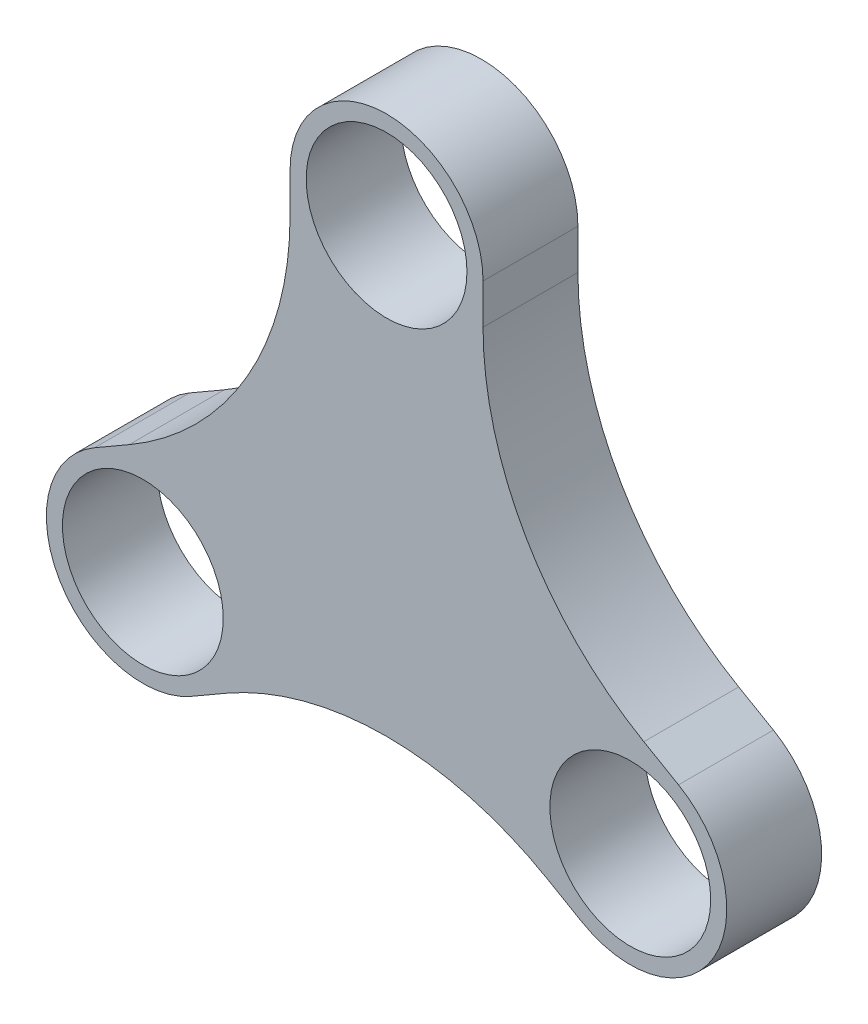
ISO-10303-21;
HEADER;
FILE_DESCRIPTION(('STEP AP214'),'2;1');
FILE_NAME('part.step','',(''),(''),'','','');
FILE_SCHEMA(('AUTOMOTIVE_DESIGN { 1 0 10303 214 1 1 1 1 }'));
ENDSEC;
DATA;
#1=APPLICATION_CONTEXT('core data for automotive mechanical design processes');
#2=APPLICATION_PROTOCOL_DEFINITION('international standard','automotive_design',2000,#1);
#3=PRODUCT_CONTEXT('',#1,'mechanical');
#4=PRODUCT('Part','Part','',(#3));
#5=PRODUCT_RELATED_PRODUCT_CATEGORY('part','',(#4));
#6=PRODUCT_DEFINITION_FORMATION('','',#4);
#7=PRODUCT_DEFINITION_CONTEXT('part definition',#1,'design');
#8=PRODUCT_DEFINITION('design','',#6,#7);
#9=PRODUCT_DEFINITION_SHAPE('','',#8);
#10=(LENGTH_UNIT() NAMED_UNIT(*) SI_UNIT(.MILLI.,.METRE.));
#11=(NAMED_UNIT(*) PLANE_ANGLE_UNIT() SI_UNIT($,.RADIAN.));
#12=(NAMED_UNIT(*) SI_UNIT($,.STERADIAN.) SOLID_ANGLE_UNIT());
#13=UNCERTAINTY_MEASURE_WITH_UNIT(LENGTH_MEASURE(1.E-05),#10,'distance_accuracy_value','');
#14=(GEOMETRIC_REPRESENTATION_CONTEXT(3) GLOBAL_UNCERTAINTY_ASSIGNED_CONTEXT((#13)) GLOBAL_UNIT_ASSIGNED_CONTEXT((#10,
#11,#12)) REPRESENTATION_CONTEXT('',''));
#15=CARTESIAN_POINT('',(0.,0.,0.));
#16=DIRECTION('',(0.,0.,1.));
#17=DIRECTION('',(1.,0.,0.));
#18=AXIS2_PLACEMENT_3D('',#15,#16,#17);
#19=CARTESIAN_POINT('',(0.,175.,59.));
#20=DIRECTION('',(0.,0.,-1.));
#21=DIRECTION('',(-1.,0.,0.));
#22=AXIS2_PLACEMENT_3D('',#19,#20,#21);
#23=CYLINDRICAL_SURFACE('',#22,60.);
#24=CARTESIAN_POINT('',(0.,175.,0.));
#25=DIRECTION('',(0.,0.,1.));
#26=DIRECTION('',(-1.,0.,0.));
#27=AXIS2_PLACEMENT_3D('',#24,#25,#26);
#28=CIRCLE('',#27,60.);
#29=CARTESIAN_POINT('',(60.,175.,0.));
#30=VERTEX_POINT('',#29);
#31=CARTESIAN_POINT('',(-60.,175.,0.));
#32=VERTEX_POINT('',#31);
#33=EDGE_CURVE('E159',#30,#32,#28,.T.);
#34=ORIENTED_EDGE('',*,*,#33,.T.);
#35=DIRECTION('',(0.,0.,-1.));
#36=VECTOR('',#35,1.);
#37=CARTESIAN_POINT('',(-60.,175.,59.));
#38=LINE('',#37,#36);
#39=CARTESIAN_POINT('',(-60.,175.,59.));
#40=VERTEX_POINT('',#39);
#41=EDGE_CURVE('E11',#40,#32,#38,.T.);
#42=ORIENTED_EDGE('',*,*,#41,.F.);
#43=CARTESIAN_POINT('',(0.,175.,59.));
#44=DIRECTION('',(0.,0.,1.));
#45=DIRECTION('',(-1.,0.,0.));
#46=AXIS2_PLACEMENT_3D('',#43,#44,#45);
#47=CIRCLE('',#46,60.);
#48=CARTESIAN_POINT('',(60.,175.,59.));
#49=VERTEX_POINT('',#48);
#50=EDGE_CURVE('E182',#49,#40,#47,.T.);
#51=ORIENTED_EDGE('',*,*,#50,.F.);
#52=DIRECTION('',(0.,0.,-1.));
#53=VECTOR('',#52,1.);
#54=CARTESIAN_POINT('',(60.,175.,59.));
#55=LINE('',#54,#53);
#56=EDGE_CURVE('E155',#49,#30,#55,.T.);
#57=ORIENTED_EDGE('',*,*,#56,.T.);
#58=EDGE_LOOP('',(#34,#42,#51,#57));
#59=FACE_BOUND('',#58,.T.);
#60=ADVANCED_FACE('F39',(#59),#23,.T.);
#61=CARTESIAN_POINT('',(-60.,150.111069989304,59.));
#62=DIRECTION('',(1.,0.,0.));
#63=DIRECTION('',(0.,1.,0.));
#64=AXIS2_PLACEMENT_3D('',#61,#62,#63);
#65=PLANE('',#64);
#66=DIRECTION('',(0.,-1.,0.));
#67=VECTOR('',#66,1.);
#68=CARTESIAN_POINT('',(-60.,150.111069989304,0.));
#69=LINE('',#68,#67);
#70=CARTESIAN_POINT('',(-60.,150.111069989304,0.));
#71=VERTEX_POINT('',#70);
#72=EDGE_CURVE('E162',#32,#71,#69,.T.);
#73=ORIENTED_EDGE('',*,*,#72,.T.);
#74=DIRECTION('',(0.,0.,-1.));
#75=VECTOR('',#74,1.);
#76=CARTESIAN_POINT('',(-60.,150.111069989304,59.));
#77=LINE('',#76,#75);
#78=CARTESIAN_POINT('',(-60.,150.111069989304,59.));
#79=VERTEX_POINT('',#78);
#80=EDGE_CURVE('E47',#79,#71,#77,.T.);
#81=ORIENTED_EDGE('',*,*,#80,.F.);
#82=DIRECTION('',(0.,-1.,0.));
#83=VECTOR('',#82,1.);
#84=CARTESIAN_POINT('',(-60.,150.111069989304,59.));
#85=LINE('',#84,#83);
#86=EDGE_CURVE('E110',#40,#79,#85,.T.);
#87=ORIENTED_EDGE('',*,*,#86,.F.);
#88=ORIENTED_EDGE('',*,*,#41,.T.);
#89=EDGE_LOOP('',(#73,#81,#87,#88));
#90=FACE_BOUND('',#89,.T.);
#91=ADVANCED_FACE('F261',(#90),#65,.F.);
#92=CARTESIAN_POINT('',(-260.,150.111069989303,59.));
#93=DIRECTION('',(0.,0.,-1.));
#94=DIRECTION('',(-1.,0.,0.));
#95=AXIS2_PLACEMENT_3D('',#92,#93,#94);
#96=CYLINDRICAL_SURFACE('',#95,200.);
#97=CARTESIAN_POINT('',(-260.,150.111069989303,0.));
#98=DIRECTION('',(0.,0.,-1.));
#99=DIRECTION('',(-1.,0.,0.));
#100=AXIS2_PLACEMENT_3D('',#97,#98,#99);
#101=CIRCLE('',#100,200.);
#102=CARTESIAN_POINT('',(-160.000000000001,-23.0940107675855,0.));
#103=VERTEX_POINT('',#102);
#104=EDGE_CURVE('E165',#71,#103,#101,.T.);
#105=ORIENTED_EDGE('',*,*,#104,.T.);
#106=DIRECTION('',(0.,0.,-1.));
#107=VECTOR('',#106,1.);
#108=CARTESIAN_POINT('',(-160.000000000001,-23.0940107675855,59.));
#109=LINE('',#108,#107);
#110=CARTESIAN_POINT('',(-160.000000000001,-23.0940107675855,59.));
#111=VERTEX_POINT('',#110);
#112=EDGE_CURVE('E201',#111,#103,#109,.T.);
#113=ORIENTED_EDGE('',*,*,#112,.F.);
#114=CARTESIAN_POINT('',(-260.,150.111069989303,59.));
#115=DIRECTION('',(0.,0.,-1.));
#116=DIRECTION('',(-1.,0.,0.));
#117=AXIS2_PLACEMENT_3D('',#114,#115,#116);
#118=CIRCLE('',#117,200.);
#119=EDGE_CURVE('E209',#79,#111,#118,.T.);
#120=ORIENTED_EDGE('',*,*,#119,.F.);
#121=ORIENTED_EDGE('',*,*,#80,.T.);
#122=EDGE_LOOP('',(#105,#113,#120,#121));
#123=FACE_BOUND('',#122,.T.);
#124=ADVANCED_FACE('F207',(#123),#96,.F.);
#125=CARTESIAN_POINT('',(-160.000000000001,-23.0940107675855,59.));
#126=DIRECTION('',(0.500000000000001,-0.866025403784438,0.));
#127=DIRECTION('',(0.866025403784438,0.500000000000001,0.));
#128=AXIS2_PLACEMENT_3D('',#125,#126,#127);
#129=PLANE('',#128);
#130=DIRECTION('',(-0.866025403784438,-0.500000000000001,0.));
#131=VECTOR('',#130,1.);
#132=CARTESIAN_POINT('',(-160.000000000001,-23.0940107675855,0.));
#133=LINE('',#132,#131);
#134=CARTESIAN_POINT('',(-181.554445662277,-35.5384757729338,0.));
#135=VERTEX_POINT('',#134);
#136=EDGE_CURVE('E167',#103,#135,#133,.T.);
#137=ORIENTED_EDGE('',*,*,#136,.T.);
#138=DIRECTION('',(0.,0.,-1.));
#139=VECTOR('',#138,1.);
#140=CARTESIAN_POINT('',(-181.554445662277,-35.5384757729338,59.));
#141=LINE('',#140,#139);
#142=CARTESIAN_POINT('',(-181.554445662277,-35.5384757729338,59.));
#143=VERTEX_POINT('',#142);
#144=EDGE_CURVE('E198',#143,#135,#141,.T.);
#145=ORIENTED_EDGE('',*,*,#144,.F.);
#146=DIRECTION('',(-0.866025403784438,-0.500000000000001,0.));
#147=VECTOR('',#146,1.);
#148=CARTESIAN_POINT('',(-160.000000000001,-23.0940107675855,59.));
#149=LINE('',#148,#147);
#150=EDGE_CURVE('E227',#111,#143,#149,.T.);
#151=ORIENTED_EDGE('',*,*,#150,.F.);
#152=ORIENTED_EDGE('',*,*,#112,.T.);
#153=EDGE_LOOP('',(#137,#145,#151,#152));
#154=FACE_BOUND('',#153,.T.);
#155=ADVANCED_FACE('F218',(#154),#129,.F.);
#156=CARTESIAN_POINT('',(-151.554445662277,-87.5,59.));
#157=DIRECTION('',(0.,0.,-1.));
#158=DIRECTION('',(-1.,0.,0.));
#159=AXIS2_PLACEMENT_3D('',#156,#157,#158);
#160=CYLINDRICAL_SURFACE('',#159,59.9999999999999);
#161=CARTESIAN_POINT('',(-151.554445662277,-87.5,0.));
#162=DIRECTION('',(0.,0.,1.));
#163=DIRECTION('',(-1.,0.,0.));
#164=AXIS2_PLACEMENT_3D('',#161,#162,#163);
#165=CIRCLE('',#164,59.9999999999999);
#166=CARTESIAN_POINT('',(-121.554445662277,-139.461524227066,0.));
#167=VERTEX_POINT('',#166);
#168=EDGE_CURVE('E169',#135,#167,#165,.T.);
#169=ORIENTED_EDGE('',*,*,#168,.T.);
#170=DIRECTION('',(0.,0.,-1.));
#171=VECTOR('',#170,1.);
#172=CARTESIAN_POINT('',(-121.554445662277,-139.461524227066,59.));
#173=LINE('',#172,#171);
#174=CARTESIAN_POINT('',(-121.554445662277,-139.461524227066,59.));
#175=VERTEX_POINT('',#174);
#176=EDGE_CURVE('E195',#175,#167,#173,.T.);
#177=ORIENTED_EDGE('',*,*,#176,.F.);
#178=CARTESIAN_POINT('',(-151.554445662277,-87.5,59.));
#179=DIRECTION('',(0.,0.,1.));
#180=DIRECTION('',(-1.,0.,0.));
#181=AXIS2_PLACEMENT_3D('',#178,#179,#180);
#182=CIRCLE('',#181,59.9999999999999);
#183=EDGE_CURVE('E224',#143,#175,#182,.T.);
#184=ORIENTED_EDGE('',*,*,#183,.F.);
#185=ORIENTED_EDGE('',*,*,#144,.T.);
#186=EDGE_LOOP('',(#169,#177,#184,#185));
#187=FACE_BOUND('',#186,.T.);
#188=ADVANCED_FACE('F222',(#187),#160,.T.);
#189=CARTESIAN_POINT('',(-100.000000000001,-127.017059221718,59.));
#190=DIRECTION('',(-0.5,0.866025403784438,0.));
#191=DIRECTION('',(-0.866025403784439,-0.5,0.));
#192=AXIS2_PLACEMENT_3D('',#189,#190,#191);
#193=PLANE('',#192);
#194=DIRECTION('',(0.866025403784439,0.5,0.));
#195=VECTOR('',#194,1.);
#196=CARTESIAN_POINT('',(-100.000000000001,-127.017059221718,0.));
#197=LINE('',#196,#195);
#198=CARTESIAN_POINT('',(-100.000000000001,-127.017059221718,0.));
#199=VERTEX_POINT('',#198);
#200=EDGE_CURVE('E171',#167,#199,#197,.T.);
#201=ORIENTED_EDGE('',*,*,#200,.T.);
#202=DIRECTION('',(0.,0.,-1.));
#203=VECTOR('',#202,1.);
#204=CARTESIAN_POINT('',(-100.000000000001,-127.017059221718,59.));
#205=LINE('',#204,#203);
#206=CARTESIAN_POINT('',(-100.000000000001,-127.017059221718,59.));
#207=VERTEX_POINT('',#206);
#208=EDGE_CURVE('E192',#207,#199,#205,.T.);
#209=ORIENTED_EDGE('',*,*,#208,.F.);
#210=DIRECTION('',(0.866025403784439,0.5,0.));
#211=VECTOR('',#210,1.);
#212=CARTESIAN_POINT('',(-100.000000000001,-127.017059221718,59.));
#213=LINE('',#212,#211);
#214=EDGE_CURVE('E226',#175,#207,#213,.T.);
#215=ORIENTED_EDGE('',*,*,#214,.F.);
#216=ORIENTED_EDGE('',*,*,#176,.T.);
#217=EDGE_LOOP('',(#201,#209,#215,#216));
#218=FACE_BOUND('',#217,.T.);
#219=ADVANCED_FACE('F274',(#218),#193,.F.);
#220=CARTESIAN_POINT('',(0.,-300.222139978605,59.));
#221=DIRECTION('',(0.,0.,-1.));
#222=DIRECTION('',(-1.,0.,0.));
#223=AXIS2_PLACEMENT_3D('',#220,#221,#222);
#224=CYLINDRICAL_SURFACE('',#223,200.);
#225=CARTESIAN_POINT('',(0.,-300.222139978605,0.));
#226=DIRECTION('',(0.,0.,-1.));
#227=DIRECTION('',(-1.,0.,0.));
#228=AXIS2_PLACEMENT_3D('',#225,#226,#227);
#229=CIRCLE('',#228,200.);
#230=CARTESIAN_POINT('',(100.000000000001,-127.017059221718,0.));
#231=VERTEX_POINT('',#230);
#232=EDGE_CURVE('E173',#199,#231,#229,.T.);
#233=ORIENTED_EDGE('',*,*,#232,.T.);
#234=DIRECTION('',(0.,0.,-1.));
#235=VECTOR('',#234,1.);
#236=CARTESIAN_POINT('',(100.000000000001,-127.017059221718,59.));
#237=LINE('',#236,#235);
#238=CARTESIAN_POINT('',(100.000000000001,-127.017059221718,59.));
#239=VERTEX_POINT('',#238);
#240=EDGE_CURVE('E189',#239,#231,#237,.T.);
#241=ORIENTED_EDGE('',*,*,#240,.F.);
#242=CARTESIAN_POINT('',(0.,-300.222139978605,59.));
#243=DIRECTION('',(0.,0.,-1.));
#244=DIRECTION('',(-1.,0.,0.));
#245=AXIS2_PLACEMENT_3D('',#242,#243,#244);
#246=CIRCLE('',#245,200.);
#247=EDGE_CURVE('E229',#207,#239,#246,.T.);
#248=ORIENTED_EDGE('',*,*,#247,.F.);
#249=ORIENTED_EDGE('',*,*,#208,.T.);
#250=EDGE_LOOP('',(#233,#241,#248,#249));
#251=FACE_BOUND('',#250,.T.);
#252=ADVANCED_FACE('F277',(#251),#224,.F.);
#253=CARTESIAN_POINT('',(100.000000000001,-127.017059221718,59.));
#254=DIRECTION('',(0.5,0.866025403784438,0.));
#255=DIRECTION('',(-0.866025403784439,0.5,0.));
#256=AXIS2_PLACEMENT_3D('',#253,#254,#255);
#257=PLANE('',#256);
#258=DIRECTION('',(0.866025403784439,-0.5,0.));
#259=VECTOR('',#258,1.);
#260=CARTESIAN_POINT('',(100.000000000001,-127.017059221718,0.));
#261=LINE('',#260,#259);
#262=CARTESIAN_POINT('',(121.554445662277,-139.461524227066,0.));
#263=VERTEX_POINT('',#262);
#264=EDGE_CURVE('E175',#231,#263,#261,.T.);
#265=ORIENTED_EDGE('',*,*,#264,.T.);
#266=DIRECTION('',(0.,0.,-1.));
#267=VECTOR('',#266,1.);
#268=CARTESIAN_POINT('',(121.554445662277,-139.461524227066,59.));
#269=LINE('',#268,#267);
#270=CARTESIAN_POINT('',(121.554445662277,-139.461524227066,59.));
#271=VERTEX_POINT('',#270);
#272=EDGE_CURVE('E186',#271,#263,#269,.T.);
#273=ORIENTED_EDGE('',*,*,#272,.F.);
#274=DIRECTION('',(0.866025403784439,-0.5,0.));
#275=VECTOR('',#274,1.);
#276=CARTESIAN_POINT('',(100.000000000001,-127.017059221718,59.));
#277=LINE('',#276,#275);
#278=EDGE_CURVE('E235',#239,#271,#277,.T.);
#279=ORIENTED_EDGE('',*,*,#278,.F.);
#280=ORIENTED_EDGE('',*,*,#240,.T.);
#281=EDGE_LOOP('',(#265,#273,#279,#280));
#282=FACE_BOUND('',#281,.T.);
#283=ADVANCED_FACE('F241',(#282),#257,.F.);
#284=CARTESIAN_POINT('',(151.554445662277,-87.5,59.));
#285=DIRECTION('',(0.,0.,-1.));
#286=DIRECTION('',(-1.,0.,0.));
#287=AXIS2_PLACEMENT_3D('',#284,#285,#286);
#288=CYLINDRICAL_SURFACE('',#287,60.);
#289=CARTESIAN_POINT('',(151.554445662277,-87.5,0.));
#290=DIRECTION('',(0.,0.,1.));
#291=DIRECTION('',(-1.,0.,0.));
#292=AXIS2_PLACEMENT_3D('',#289,#290,#291);
#293=CIRCLE('',#292,60.);
#294=CARTESIAN_POINT('',(181.554445662277,-35.5384757729338,0.));
#295=VERTEX_POINT('',#294);
#296=EDGE_CURVE('E177',#263,#295,#293,.T.);
#297=ORIENTED_EDGE('',*,*,#296,.T.);
#298=DIRECTION('',(0.,0.,-1.));
#299=VECTOR('',#298,1.);
#300=CARTESIAN_POINT('',(181.554445662277,-35.5384757729338,59.));
#301=LINE('',#300,#299);
#302=CARTESIAN_POINT('',(181.554445662277,-35.5384757729338,59.));
#303=VERTEX_POINT('',#302);
#304=EDGE_CURVE('E150',#303,#295,#301,.T.);
#305=ORIENTED_EDGE('',*,*,#304,.F.);
#306=CARTESIAN_POINT('',(151.554445662277,-87.5,59.));
#307=DIRECTION('',(0.,0.,1.));
#308=DIRECTION('',(-1.,0.,0.));
#309=AXIS2_PLACEMENT_3D('',#306,#307,#308);
#310=CIRCLE('',#309,60.);
#311=EDGE_CURVE('E141',#271,#303,#310,.T.);
#312=ORIENTED_EDGE('',*,*,#311,.F.);
#313=ORIENTED_EDGE('',*,*,#272,.T.);
#314=EDGE_LOOP('',(#297,#305,#312,#313));
#315=FACE_BOUND('',#314,.T.);
#316=ADVANCED_FACE('F245',(#315),#288,.T.);
#317=CARTESIAN_POINT('',(160.000000000001,-23.0940107675855,59.));
#318=DIRECTION('',(-0.5,-0.866025403784439,0.));
#319=DIRECTION('',(0.866025403784439,-0.5,0.));
#320=AXIS2_PLACEMENT_3D('',#317,#318,#319);
#321=PLANE('',#320);
#322=DIRECTION('',(-0.866025403784438,0.5,0.));
#323=VECTOR('',#322,1.);
#324=CARTESIAN_POINT('',(160.000000000001,-23.0940107675855,0.));
#325=LINE('',#324,#323);
#326=CARTESIAN_POINT('',(160.000000000001,-23.0940107675855,0.));
#327=VERTEX_POINT('',#326);
#328=EDGE_CURVE('E149',#295,#327,#325,.T.);
#329=ORIENTED_EDGE('',*,*,#328,.T.);
#330=DIRECTION('',(0.,0.,-1.));
#331=VECTOR('',#330,1.);
#332=CARTESIAN_POINT('',(160.000000000001,-23.0940107675855,59.));
#333=LINE('',#332,#331);
#334=CARTESIAN_POINT('',(160.000000000001,-23.0940107675855,59.));
#335=VERTEX_POINT('',#334);
#336=EDGE_CURVE('E146',#335,#327,#333,.T.);
#337=ORIENTED_EDGE('',*,*,#336,.F.);
#338=DIRECTION('',(-0.866025403784438,0.5,0.));
#339=VECTOR('',#338,1.);
#340=CARTESIAN_POINT('',(160.000000000001,-23.0940107675855,59.));
#341=LINE('',#340,#339);
#342=EDGE_CURVE('E135',#303,#335,#341,.T.);
#343=ORIENTED_EDGE('',*,*,#342,.F.);
#344=ORIENTED_EDGE('',*,*,#304,.T.);
#345=EDGE_LOOP('',(#329,#337,#343,#344));
#346=FACE_BOUND('',#345,.T.);
#347=ADVANCED_FACE('F147',(#346),#321,.F.);
#348=CARTESIAN_POINT('',(260.,150.111069989303,59.));
#349=DIRECTION('',(0.,0.,-1.));
#350=DIRECTION('',(-1.,0.,0.));
#351=AXIS2_PLACEMENT_3D('',#348,#349,#350);
#352=CYLINDRICAL_SURFACE('',#351,200.);
#353=CARTESIAN_POINT('',(260.,150.111069989303,0.));
#354=DIRECTION('',(0.,0.,-1.));
#355=DIRECTION('',(-1.,0.,0.));
#356=AXIS2_PLACEMENT_3D('',#353,#354,#355);
#357=CIRCLE('',#356,200.);
#358=CARTESIAN_POINT('',(60.,150.111069989303,0.));
#359=VERTEX_POINT('',#358);
#360=EDGE_CURVE('E96',#327,#359,#357,.T.);
#361=ORIENTED_EDGE('',*,*,#360,.T.);
#362=DIRECTION('',(0.,0.,-1.));
#363=VECTOR('',#362,1.);
#364=CARTESIAN_POINT('',(60.,150.111069989303,59.));
#365=LINE('',#364,#363);
#366=CARTESIAN_POINT('',(60.,150.111069989303,59.));
#367=VERTEX_POINT('',#366);
#368=EDGE_CURVE('E151',#367,#359,#365,.T.);
#369=ORIENTED_EDGE('',*,*,#368,.F.);
#370=CARTESIAN_POINT('',(260.,150.111069989303,59.));
#371=DIRECTION('',(0.,0.,-1.));
#372=DIRECTION('',(-1.,0.,0.));
#373=AXIS2_PLACEMENT_3D('',#370,#371,#372);
#374=CIRCLE('',#373,200.);
#375=EDGE_CURVE('E139',#335,#367,#374,.T.);
#376=ORIENTED_EDGE('',*,*,#375,.F.);
#377=ORIENTED_EDGE('',*,*,#336,.T.);
#378=EDGE_LOOP('',(#361,#369,#376,#377));
#379=FACE_BOUND('',#378,.T.);
#380=ADVANCED_FACE('F153',(#379),#352,.F.);
#381=CARTESIAN_POINT('',(60.,150.111069989304,59.));
#382=DIRECTION('',(-1.,0.,0.));
#383=DIRECTION('',(0.,-1.,0.));
#384=AXIS2_PLACEMENT_3D('',#381,#382,#383);
#385=PLANE('',#384);
#386=DIRECTION('',(0.,1.,0.));
#387=VECTOR('',#386,1.);
#388=CARTESIAN_POINT('',(60.,150.111069989304,0.));
#389=LINE('',#388,#387);
#390=EDGE_CURVE('E102',#359,#30,#389,.T.);
#391=ORIENTED_EDGE('',*,*,#390,.T.);
#392=ORIENTED_EDGE('',*,*,#56,.F.);
#393=DIRECTION('',(0.,1.,0.));
#394=VECTOR('',#393,1.);
#395=CARTESIAN_POINT('',(60.,150.111069989304,59.));
#396=LINE('',#395,#394);
#397=EDGE_CURVE('E55',#367,#49,#396,.T.);
#398=ORIENTED_EDGE('',*,*,#397,.F.);
#399=ORIENTED_EDGE('',*,*,#368,.T.);
#400=EDGE_LOOP('',(#391,#392,#398,#399));
#401=FACE_BOUND('',#400,.T.);
#402=ADVANCED_FACE('F249',(#401),#385,.F.);
#403=CARTESIAN_POINT('',(0.,175.,59.));
#404=DIRECTION('',(0.,0.,-1.));
#405=DIRECTION('',(-1.,0.,0.));
#406=AXIS2_PLACEMENT_3D('',#403,#404,#405);
#407=PLANE('',#406);
#408=CARTESIAN_POINT('',(-151.554445662277,-87.5,59.));
#409=DIRECTION('',(0.,0.,1.));
#410=DIRECTION('',(1.,0.,0.));
#411=AXIS2_PLACEMENT_3D('',#408,#409,#410);
#412=CIRCLE('',#411,50.);
#413=CARTESIAN_POINT('',(-101.554445662277,-87.5,59.));
#414=VERTEX_POINT('',#413);
#415=EDGE_CURVE('E353',#414,#414,#412,.T.);
#416=ORIENTED_EDGE('',*,*,#415,.F.);
#417=EDGE_LOOP('',(#416));
#418=FACE_BOUND('',#417,.T.);
#419=CARTESIAN_POINT('',(0.,175.,59.));
#420=DIRECTION('',(0.,0.,1.));
#421=DIRECTION('',(1.,0.,0.));
#422=AXIS2_PLACEMENT_3D('',#419,#420,#421);
#423=CIRCLE('',#422,50.);
#424=CARTESIAN_POINT('',(50.,175.,59.));
#425=VERTEX_POINT('',#424);
#426=EDGE_CURVE('E354',#425,#425,#423,.T.);
#427=ORIENTED_EDGE('',*,*,#426,.F.);
#428=EDGE_LOOP('',(#427));
#429=FACE_BOUND('',#428,.T.);
#430=CARTESIAN_POINT('',(151.554445662277,-87.5,59.));
#431=DIRECTION('',(0.,0.,1.));
#432=DIRECTION('',(1.,0.,0.));
#433=AXIS2_PLACEMENT_3D('',#430,#431,#432);
#434=CIRCLE('',#433,50.);
#435=CARTESIAN_POINT('',(201.554445662277,-87.5,59.));
#436=VERTEX_POINT('',#435);
#437=EDGE_CURVE('E363',#436,#436,#434,.T.);
#438=ORIENTED_EDGE('',*,*,#437,.F.);
#439=EDGE_LOOP('',(#438));
#440=FACE_BOUND('',#439,.T.);
#441=ORIENTED_EDGE('',*,*,#50,.T.);
#442=ORIENTED_EDGE('',*,*,#86,.T.);
#443=ORIENTED_EDGE('',*,*,#119,.T.);
#444=ORIENTED_EDGE('',*,*,#150,.T.);
#445=ORIENTED_EDGE('',*,*,#183,.T.);
#446=ORIENTED_EDGE('',*,*,#214,.T.);
#447=ORIENTED_EDGE('',*,*,#247,.T.);
#448=ORIENTED_EDGE('',*,*,#278,.T.);
#449=ORIENTED_EDGE('',*,*,#311,.T.);
#450=ORIENTED_EDGE('',*,*,#342,.T.);
#451=ORIENTED_EDGE('',*,*,#375,.T.);
#452=ORIENTED_EDGE('',*,*,#397,.T.);
#453=EDGE_LOOP('',(#441,#442,#443,#444,#445,#446,#447,#448,#449,#450,#451,#452));
#454=FACE_BOUND('',#453,.T.);
#455=ADVANCED_FACE('F137',(#418,#429,#440,#454),#407,.F.);
#456=CARTESIAN_POINT('',(0.,175.,0.));
#457=DIRECTION('',(0.,0.,-1.));
#458=DIRECTION('',(-1.,0.,0.));
#459=AXIS2_PLACEMENT_3D('',#456,#457,#458);
#460=PLANE('',#459);
#461=CARTESIAN_POINT('',(-151.554445662277,-87.5,0.));
#462=DIRECTION('',(0.,0.,1.));
#463=DIRECTION('',(1.,0.,0.));
#464=AXIS2_PLACEMENT_3D('',#461,#462,#463);
#465=CIRCLE('',#464,50.);
#466=CARTESIAN_POINT('',(-101.554445662277,-87.5,0.));
#467=VERTEX_POINT('',#466);
#468=EDGE_CURVE('E163',#467,#467,#465,.T.);
#469=ORIENTED_EDGE('',*,*,#468,.T.);
#470=EDGE_LOOP('',(#469));
#471=FACE_BOUND('',#470,.T.);
#472=CARTESIAN_POINT('',(0.,175.,0.));
#473=DIRECTION('',(0.,0.,1.));
#474=DIRECTION('',(1.,0.,0.));
#475=AXIS2_PLACEMENT_3D('',#472,#473,#474);
#476=CIRCLE('',#475,50.);
#477=CARTESIAN_POINT('',(50.,175.,0.));
#478=VERTEX_POINT('',#477);
#479=EDGE_CURVE('E358',#478,#478,#476,.T.);
#480=ORIENTED_EDGE('',*,*,#479,.T.);
#481=EDGE_LOOP('',(#480));
#482=FACE_BOUND('',#481,.T.);
#483=CARTESIAN_POINT('',(151.554445662277,-87.5,0.));
#484=DIRECTION('',(0.,0.,1.));
#485=DIRECTION('',(1.,0.,0.));
#486=AXIS2_PLACEMENT_3D('',#483,#484,#485);
#487=CIRCLE('',#486,50.);
#488=CARTESIAN_POINT('',(201.554445662277,-87.5,0.));
#489=VERTEX_POINT('',#488);
#490=EDGE_CURVE('E366',#489,#489,#487,.T.);
#491=ORIENTED_EDGE('',*,*,#490,.T.);
#492=EDGE_LOOP('',(#491));
#493=FACE_BOUND('',#492,.T.);
#494=ORIENTED_EDGE('',*,*,#33,.F.);
#495=ORIENTED_EDGE('',*,*,#390,.F.);
#496=ORIENTED_EDGE('',*,*,#360,.F.);
#497=ORIENTED_EDGE('',*,*,#328,.F.);
#498=ORIENTED_EDGE('',*,*,#296,.F.);
#499=ORIENTED_EDGE('',*,*,#264,.F.);
#500=ORIENTED_EDGE('',*,*,#232,.F.);
#501=ORIENTED_EDGE('',*,*,#200,.F.);
#502=ORIENTED_EDGE('',*,*,#168,.F.);
#503=ORIENTED_EDGE('',*,*,#136,.F.);
#504=ORIENTED_EDGE('',*,*,#104,.F.);
#505=ORIENTED_EDGE('',*,*,#72,.F.);
#506=EDGE_LOOP('',(#494,#495,#496,#497,#498,#499,#500,#501,#502,#503,#504,#505));
#507=FACE_BOUND('',#506,.T.);
#508=ADVANCED_FACE('F213',(#471,#482,#493,#507),#460,.T.);
#509=CARTESIAN_POINT('',(151.554445662277,-87.5,0.));
#510=DIRECTION('',(0.,0.,1.));
#511=DIRECTION('',(1.,0.,0.));
#512=AXIS2_PLACEMENT_3D('',#509,#510,#511);
#513=CYLINDRICAL_SURFACE('',#512,50.);
#514=ORIENTED_EDGE('',*,*,#490,.F.);
#515=EDGE_LOOP('',(#514));
#516=FACE_BOUND('',#515,.T.);
#517=ORIENTED_EDGE('',*,*,#437,.T.);
#518=EDGE_LOOP('',(#517));
#519=FACE_BOUND('',#518,.T.);
#520=ADVANCED_FACE('F316',(#516,#519),#513,.F.);
#521=CARTESIAN_POINT('',(0.,175.,0.));
#522=DIRECTION('',(0.,0.,1.));
#523=DIRECTION('',(1.,0.,0.));
#524=AXIS2_PLACEMENT_3D('',#521,#522,#523);
#525=CYLINDRICAL_SURFACE('',#524,50.);
#526=ORIENTED_EDGE('',*,*,#479,.F.);
#527=EDGE_LOOP('',(#526));
#528=FACE_BOUND('',#527,.T.);
#529=ORIENTED_EDGE('',*,*,#426,.T.);
#530=EDGE_LOOP('',(#529));
#531=FACE_BOUND('',#530,.T.);
#532=ADVANCED_FACE('F325',(#528,#531),#525,.F.);
#533=CARTESIAN_POINT('',(-151.554445662277,-87.5,0.));
#534=DIRECTION('',(0.,0.,1.));
#535=DIRECTION('',(1.,0.,0.));
#536=AXIS2_PLACEMENT_3D('',#533,#534,#535);
#537=CYLINDRICAL_SURFACE('',#536,50.);
#538=ORIENTED_EDGE('',*,*,#468,.F.);
#539=EDGE_LOOP('',(#538));
#540=FACE_BOUND('',#539,.T.);
#541=ORIENTED_EDGE('',*,*,#415,.T.);
#542=EDGE_LOOP('',(#541));
#543=FACE_BOUND('',#542,.T.);
#544=ADVANCED_FACE('F335',(#540,#543),#537,.F.);
#545=CLOSED_SHELL('',(#60,#91,#124,#155,#188,#219,#252,#283,#316,#347,#380,#402,#455,#508,#520,
#532,#544));
#546=MANIFOLD_SOLID_BREP('B2',#545);
#547=ADVANCED_BREP_SHAPE_REPRESENTATION('',(#18,#546),#14);
#548=SHAPE_DEFINITION_REPRESENTATION(#9,#547);
ENDSEC;
END-ISO-10303-21;
